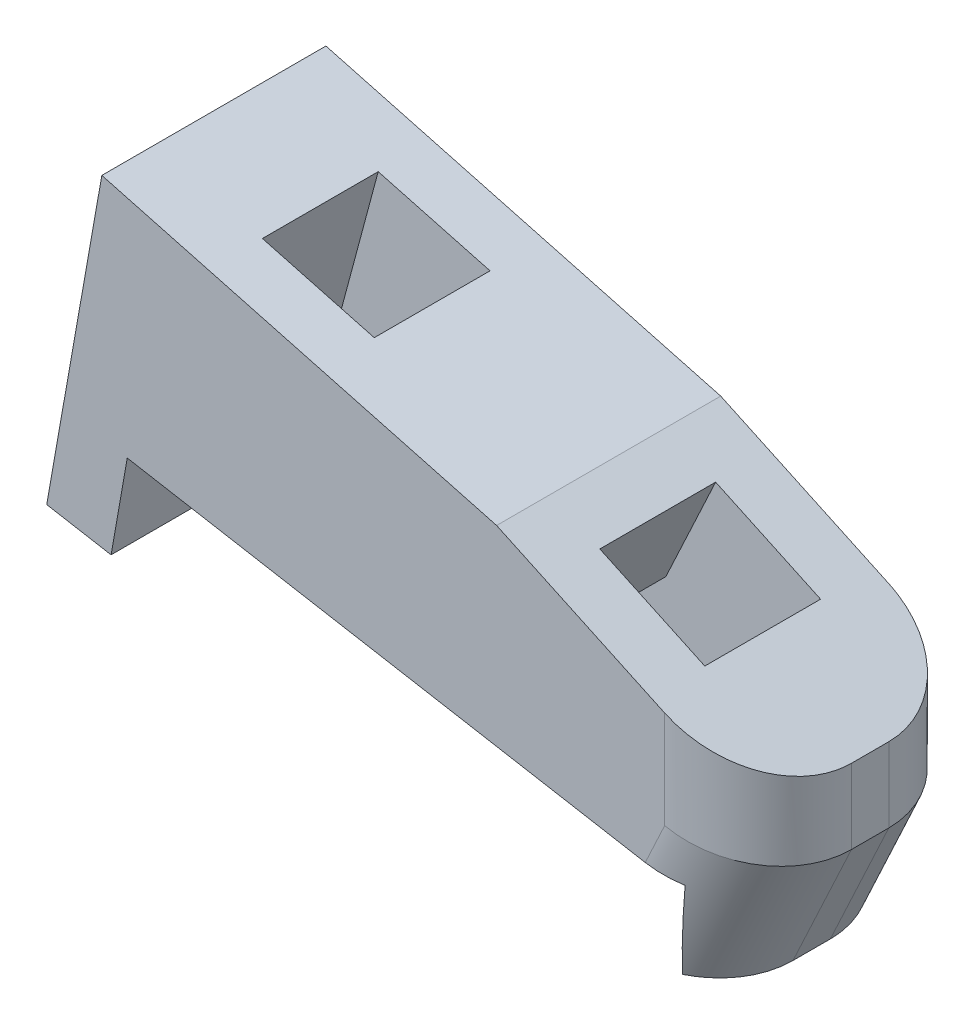
ISO-10303-21;
HEADER;
FILE_DESCRIPTION(('STEP AP214'),'2;1');
FILE_NAME('part.step','',(''),(''),'','','');
FILE_SCHEMA(('AUTOMOTIVE_DESIGN { 1 0 10303 214 1 1 1 1 }'));
ENDSEC;
DATA;
#1=APPLICATION_CONTEXT('core data for automotive mechanical design processes');
#2=APPLICATION_PROTOCOL_DEFINITION('international standard','automotive_design',2000,#1);
#3=PRODUCT_CONTEXT('',#1,'mechanical');
#4=PRODUCT('Part','Part','',(#3));
#5=PRODUCT_RELATED_PRODUCT_CATEGORY('part','',(#4));
#6=PRODUCT_DEFINITION_FORMATION('','',#4);
#7=PRODUCT_DEFINITION_CONTEXT('part definition',#1,'design');
#8=PRODUCT_DEFINITION('design','',#6,#7);
#9=PRODUCT_DEFINITION_SHAPE('','',#8);
#10=(LENGTH_UNIT() NAMED_UNIT(*) SI_UNIT(.MILLI.,.METRE.));
#11=(NAMED_UNIT(*) PLANE_ANGLE_UNIT() SI_UNIT($,.RADIAN.));
#12=(NAMED_UNIT(*) SI_UNIT($,.STERADIAN.) SOLID_ANGLE_UNIT());
#13=UNCERTAINTY_MEASURE_WITH_UNIT(LENGTH_MEASURE(1.E-05),#10,'distance_accuracy_value','');
#14=(GEOMETRIC_REPRESENTATION_CONTEXT(3) GLOBAL_UNCERTAINTY_ASSIGNED_CONTEXT((#13)) GLOBAL_UNIT_ASSIGNED_CONTEXT((#10,
#11,#12)) REPRESENTATION_CONTEXT('',''));
#15=CARTESIAN_POINT('',(0.,0.,0.));
#16=DIRECTION('',(0.,0.,1.));
#17=DIRECTION('',(1.,0.,0.));
#18=AXIS2_PLACEMENT_3D('',#15,#16,#17);
#19=CARTESIAN_POINT('',(41.0409101129452,21.9818480590372,-6.));
#20=DIRECTION('',(1.,0.,0.));
#21=DIRECTION('',(0.,0.,-1.));
#22=AXIS2_PLACEMENT_3D('',#19,#20,#21);
#23=PLANE('',#22);
#24=DIRECTION('',(0.,0.,1.));
#25=VECTOR('',#24,1.);
#26=CARTESIAN_POINT('',(41.0409101129452,21.9818480590372,-6.));
#27=LINE('',#26,#25);
#28=CARTESIAN_POINT('',(41.0409101129452,21.9818480590372,-1.));
#29=VERTEX_POINT('',#28);
#30=CARTESIAN_POINT('',(41.0409101129452,21.9818480590372,1.));
#31=VERTEX_POINT('',#30);
#32=EDGE_CURVE('E286',#29,#31,#27,.T.);
#33=ORIENTED_EDGE('',*,*,#32,.F.);
#34=DIRECTION('',(0.,1.,0.));
#35=VECTOR('',#34,1.);
#36=CARTESIAN_POINT('',(41.0409101129452,21.9818480590372,-1.));
#37=LINE('',#36,#35);
#38=CARTESIAN_POINT('',(41.0409101129452,25.9818480590371,-1.));
#39=VERTEX_POINT('',#38);
#40=EDGE_CURVE('E334',#29,#39,#37,.T.);
#41=ORIENTED_EDGE('',*,*,#40,.T.);
#42=DIRECTION('',(0.,0.,1.));
#43=VECTOR('',#42,1.);
#44=CARTESIAN_POINT('',(41.0409101129452,25.9818480590371,-6.));
#45=LINE('',#44,#43);
#46=CARTESIAN_POINT('',(41.0409101129452,25.9818480590371,1.));
#47=VERTEX_POINT('',#46);
#48=EDGE_CURVE('E285',#39,#47,#45,.T.);
#49=ORIENTED_EDGE('',*,*,#48,.T.);
#50=DIRECTION('',(0.,1.,0.));
#51=VECTOR('',#50,1.);
#52=CARTESIAN_POINT('',(41.0409101129452,21.9818480590372,1.));
#53=LINE('',#52,#51);
#54=EDGE_CURVE('E332',#47,#31,#53,.F.);
#55=ORIENTED_EDGE('',*,*,#54,.T.);
#56=EDGE_LOOP('',(#33,#41,#49,#55));
#57=FACE_BOUND('',#56,.T.);
#58=ADVANCED_FACE('F35',(#57),#23,.T.);
#59=CARTESIAN_POINT('',(37.9102707761156,15.2681703355866,-6.));
#60=DIRECTION('',(0.906307787036649,-0.422618261740702,0.));
#61=DIRECTION('',(0.422618261740702,0.906307787036649,0.));
#62=AXIS2_PLACEMENT_3D('',#59,#60,#61);
#63=PLANE('',#62);
#64=DIRECTION('',(0.,0.,1.));
#65=VECTOR('',#64,1.);
#66=CARTESIAN_POINT('',(37.9102707761156,15.2681703355866,-6.));
#67=LINE('',#66,#65);
#68=CARTESIAN_POINT('',(37.9102707761156,15.2681703355866,-1.));
#69=VERTEX_POINT('',#68);
#70=CARTESIAN_POINT('',(37.9102707761156,15.2681703355866,1.));
#71=VERTEX_POINT('',#70);
#72=EDGE_CURVE('E290',#69,#71,#67,.T.);
#73=ORIENTED_EDGE('',*,*,#72,.F.);
#74=DIRECTION('',(0.422618261740702,0.906307787036649,0.));
#75=VECTOR('',#74,1.);
#76=CARTESIAN_POINT('',(37.9102707761156,15.2681703355866,-1.));
#77=LINE('',#76,#75);
#78=EDGE_CURVE('E313',#69,#29,#77,.T.);
#79=ORIENTED_EDGE('',*,*,#78,.T.);
#80=ORIENTED_EDGE('',*,*,#32,.T.);
#81=DIRECTION('',(0.422618261740702,0.906307787036649,0.));
#82=VECTOR('',#81,1.);
#83=CARTESIAN_POINT('',(37.9102707761156,15.2681703355866,1.));
#84=LINE('',#83,#82);
#85=EDGE_CURVE('E289',#31,#71,#84,.F.);
#86=ORIENTED_EDGE('',*,*,#85,.T.);
#87=EDGE_LOOP('',(#73,#79,#80,#86));
#88=FACE_BOUND('',#87,.T.);
#89=ADVANCED_FACE('F404',(#88),#63,.T.);
#90=CARTESIAN_POINT('',(35.9406552700911,15.6154666909205,-6.));
#91=DIRECTION('',(-0.173648177666939,-0.984807753012206,0.));
#92=DIRECTION('',(0.984807753012207,-0.173648177666939,0.));
#93=AXIS2_PLACEMENT_3D('',#90,#91,#92);
#94=PLANE('',#93);
#95=DIRECTION('',(0.,0.,1.));
#96=VECTOR('',#95,1.);
#97=CARTESIAN_POINT('',(35.9406552700911,15.6154666909205,-6.));
#98=LINE('',#97,#96);
#99=CARTESIAN_POINT('',(35.9406552700911,15.6154666909205,-4.94796982235332));
#100=VERTEX_POINT('',#99);
#101=CARTESIAN_POINT('',(35.9406552700911,15.6154666909205,4.94796982235331));
#102=VERTEX_POINT('',#101);
#103=EDGE_CURVE('E293',#100,#102,#98,.T.);
#104=ORIENTED_EDGE('',*,*,#103,.F.);
#105=CARTESIAN_POINT('',(32.812530731232,16.1670394461376,-1.));
#106=DIRECTION('',(-0.173648177666939,-0.984807753012206,0.));
#107=DIRECTION('',(0.984807753012207,-0.173648177666939,0.));
#108=AXIS2_PLACEMENT_3D('',#105,#106,#107);
#109=ELLIPSE('',#108,5.17638090205041,5.);
#110=EDGE_CURVE('E330',#100,#69,#109,.T.);
#111=ORIENTED_EDGE('',*,*,#110,.T.);
#112=ORIENTED_EDGE('',*,*,#72,.T.);
#113=CARTESIAN_POINT('',(32.812530731232,16.1670394461376,1.));
#114=DIRECTION('',(-0.173648177666939,-0.984807753012206,0.));
#115=DIRECTION('',(-0.984807753012207,0.173648177666939,0.));
#116=AXIS2_PLACEMENT_3D('',#113,#114,#115);
#117=ELLIPSE('',#116,5.17638090205041,5.);
#118=EDGE_CURVE('E328',#71,#102,#117,.T.);
#119=ORIENTED_EDGE('',*,*,#118,.T.);
#120=EDGE_LOOP('',(#104,#111,#112,#119));
#121=FACE_BOUND('',#120,.T.);
#122=ADVANCED_FACE('F410',(#121),#94,.T.);
#123=CARTESIAN_POINT('',(36.8088961584259,20.5395054559815,-6.));
#124=DIRECTION('',(-0.984807753012206,0.173648177666941,0.));
#125=DIRECTION('',(-0.173648177666941,-0.984807753012206,0.));
#126=AXIS2_PLACEMENT_3D('',#123,#124,#125);
#127=PLANE('',#126);
#128=DIRECTION('',(0.,0.,1.));
#129=VECTOR('',#128,1.);
#130=CARTESIAN_POINT('',(36.8088961584259,20.5395054559815,-6.));
#131=LINE('',#130,#129);
#132=CARTESIAN_POINT('',(36.8088961584259,20.5395054559815,-5.67469095455987));
#133=VERTEX_POINT('',#132);
#134=CARTESIAN_POINT('',(36.8088961584259,20.5395054559815,5.67469095455987));
#135=VERTEX_POINT('',#134);
#136=EDGE_CURVE('E296',#133,#135,#131,.T.);
#137=ORIENTED_EDGE('',*,*,#136,.F.);
#138=CARTESIAN_POINT('',(37.9991528166323,27.2897864023461,-1.));
#139=DIRECTION('',(-0.984807753012206,0.173648177666941,0.));
#140=DIRECTION('',(0.173648177666941,0.984807753012206,0.));
#141=AXIS2_PLACEMENT_3D('',#138,#139,#140);
#142=ELLIPSE('',#141,19.3185165257819,5.);
#143=EDGE_CURVE('E326',#133,#100,#142,.T.);
#144=ORIENTED_EDGE('',*,*,#143,.T.);
#145=ORIENTED_EDGE('',*,*,#103,.T.);
#146=CARTESIAN_POINT('',(37.9991528166323,27.2897864023461,1.));
#147=DIRECTION('',(-0.984807753012206,0.173648177666941,0.));
#148=DIRECTION('',(-0.173648177666941,-0.984807753012206,0.));
#149=AXIS2_PLACEMENT_3D('',#146,#147,#148);
#150=ELLIPSE('',#149,19.3185165257819,5.);
#151=EDGE_CURVE('E324',#102,#135,#150,.T.);
#152=ORIENTED_EDGE('',*,*,#151,.T.);
#153=EDGE_LOOP('',(#137,#144,#145,#152));
#154=FACE_BOUND('',#153,.T.);
#155=ADVANCED_FACE('F440',(#154),#127,.T.);
#156=CARTESIAN_POINT('',(7.26466356805965,25.7489507859897,-6.));
#157=DIRECTION('',(-0.173648177666939,-0.984807753012206,0.));
#158=DIRECTION('',(0.984807753012206,-0.173648177666939,0.));
#159=AXIS2_PLACEMENT_3D('',#156,#157,#158);
#160=PLANE('',#159);
#161=DIRECTION('',(0.,0.,1.));
#162=VECTOR('',#161,1.);
#163=CARTESIAN_POINT('',(31.9030176814972,21.404544195541,-6.));
#164=LINE('',#163,#162);
#165=CARTESIAN_POINT('',(31.9030176814972,21.404544195541,-3.1));
#166=VERTEX_POINT('',#165);
#167=CARTESIAN_POINT('',(31.9030176814972,21.404544195541,3.1));
#168=VERTEX_POINT('',#167);
#169=EDGE_CURVE('E11',#166,#168,#164,.T.);
#170=ORIENTED_EDGE('',*,*,#169,.F.);
#171=DIRECTION('',(0.984807753012207,-0.173648177666938,0.));
#172=VECTOR('',#171,1.);
#173=CARTESIAN_POINT('',(24.4003184704721,22.7274724945849,-3.1));
#174=LINE('',#173,#172);
#175=CARTESIAN_POINT('',(24.4003184704721,22.7274724945849,-3.1));
#176=VERTEX_POINT('',#175);
#177=EDGE_CURVE('E231',#176,#166,#174,.T.);
#178=ORIENTED_EDGE('',*,*,#177,.F.);
#179=DIRECTION('',(0.,0.,-1.));
#180=VECTOR('',#179,1.);
#181=CARTESIAN_POINT('',(24.4003184704721,22.7274724945849,3.1));
#182=LINE('',#181,#180);
#183=CARTESIAN_POINT('',(24.4003184704721,22.7274724945849,3.1));
#184=VERTEX_POINT('',#183);
#185=EDGE_CURVE('E235',#184,#176,#182,.T.);
#186=ORIENTED_EDGE('',*,*,#185,.F.);
#187=DIRECTION('',(-0.984807753012207,0.173648177666938,0.));
#188=VECTOR('',#187,1.);
#189=CARTESIAN_POINT('',(24.4003184704721,22.7274724945849,3.1));
#190=LINE('',#189,#188);
#191=EDGE_CURVE('E242',#168,#184,#190,.T.);
#192=ORIENTED_EDGE('',*,*,#191,.F.);
#193=EDGE_LOOP('',(#170,#178,#186,#192));
#194=FACE_BOUND('',#193,.T.);
#195=DIRECTION('',(0.984807753012207,-0.173648177666938,0.));
#196=VECTOR('',#195,1.);
#197=CARTESIAN_POINT('',(9.62820217528898,25.332195159589,-3.1));
#198=LINE('',#197,#196);
#199=CARTESIAN_POINT('',(8.61648265880179,25.510588607255,-3.1));
#200=VERTEX_POINT('',#199);
#201=CARTESIAN_POINT('',(15.7340102439647,24.255576458054,-3.1));
#202=VERTEX_POINT('',#201);
#203=EDGE_CURVE('E367',#200,#202,#198,.T.);
#204=ORIENTED_EDGE('',*,*,#203,.F.);
#205=DIRECTION('',(0.,0.,-1.));
#206=VECTOR('',#205,1.);
#207=CARTESIAN_POINT('',(8.61648265880179,25.510588607255,-6.));
#208=LINE('',#207,#206);
#209=CARTESIAN_POINT('',(8.61648265880179,25.510588607255,3.1));
#210=VERTEX_POINT('',#209);
#211=EDGE_CURVE('E225',#210,#200,#208,.T.);
#212=ORIENTED_EDGE('',*,*,#211,.F.);
#213=DIRECTION('',(-0.984807753012207,0.173648177666938,0.));
#214=VECTOR('',#213,1.);
#215=CARTESIAN_POINT('',(9.62820217528898,25.332195159589,3.1));
#216=LINE('',#215,#214);
#217=CARTESIAN_POINT('',(15.7340102439646,24.255576458054,3.1));
#218=VERTEX_POINT('',#217);
#219=EDGE_CURVE('E366',#218,#210,#216,.T.);
#220=ORIENTED_EDGE('',*,*,#219,.F.);
#221=DIRECTION('',(0.,0.,1.));
#222=VECTOR('',#221,1.);
#223=CARTESIAN_POINT('',(15.7340102439647,24.255576458054,3.1));
#224=LINE('',#223,#222);
#225=EDGE_CURVE('E248',#202,#218,#224,.T.);
#226=ORIENTED_EDGE('',*,*,#225,.F.);
#227=EDGE_LOOP('',(#204,#212,#220,#226));
#228=FACE_BOUND('',#227,.T.);
#229=DIRECTION('',(0.984807753012207,-0.173648177666939,0.));
#230=VECTOR('',#229,1.);
#231=CARTESIAN_POINT('',(7.26466356805965,25.7489507859897,-6.));
#232=LINE('',#231,#230);
#233=CARTESIAN_POINT('',(7.26466356805965,25.7489507859897,-6.));
#234=VERTEX_POINT('',#233);
#235=CARTESIAN_POINT('',(35.0001638301643,20.8584337663336,-6.));
#236=VERTEX_POINT('',#235);
#237=EDGE_CURVE('E282',#234,#236,#232,.T.);
#238=ORIENTED_EDGE('',*,*,#237,.T.);
#239=CARTESIAN_POINT('',(35.0001638301643,20.8584337663336,-1.));
#240=DIRECTION('',(-0.173648177666939,-0.984807753012206,0.));
#241=DIRECTION('',(0.984807753012206,-0.173648177666939,0.));
#242=AXIS2_PLACEMENT_3D('',#239,#240,#241);
#243=ELLIPSE('',#242,5.17638090205041,5.);
#244=EDGE_CURVE('E322',#236,#133,#243,.T.);
#245=ORIENTED_EDGE('',*,*,#244,.T.);
#246=ORIENTED_EDGE('',*,*,#136,.T.);
#247=CARTESIAN_POINT('',(35.0001638301643,20.8584337663336,1.));
#248=DIRECTION('',(-0.173648177666939,-0.984807753012206,0.));
#249=DIRECTION('',(-0.984807753012206,0.173648177666939,0.));
#250=AXIS2_PLACEMENT_3D('',#247,#248,#249);
#251=ELLIPSE('',#250,5.17638090205041,5.);
#252=CARTESIAN_POINT('',(35.0001638301643,20.8584337663336,6.));
#253=VERTEX_POINT('',#252);
#254=EDGE_CURVE('E320',#135,#253,#251,.T.);
#255=ORIENTED_EDGE('',*,*,#254,.T.);
#256=DIRECTION('',(0.984807753012207,-0.173648177666939,0.));
#257=VECTOR('',#256,1.);
#258=CARTESIAN_POINT('',(7.26466356805965,25.7489507859897,6.));
#259=LINE('',#258,#257);
#260=CARTESIAN_POINT('',(7.26466356805965,25.7489507859897,6.));
#261=VERTEX_POINT('',#260);
#262=EDGE_CURVE('E265',#261,#253,#259,.T.);
#263=ORIENTED_EDGE('',*,*,#262,.F.);
#264=DIRECTION('',(0.,0.,1.));
#265=VECTOR('',#264,1.);
#266=CARTESIAN_POINT('',(7.26466356805965,25.7489507859897,-6.));
#267=LINE('',#266,#265);
#268=EDGE_CURVE('E299',#234,#261,#267,.T.);
#269=ORIENTED_EDGE('',*,*,#268,.F.);
#270=EDGE_LOOP('',(#238,#245,#246,#255,#263,#269));
#271=FACE_BOUND('',#270,.T.);
#272=ADVANCED_FACE('F363',(#194,#228,#271),#160,.T.);
#273=CARTESIAN_POINT('',(6.39642267972497,20.8249120209286,-6.));
#274=DIRECTION('',(0.984807753012207,-0.173648177666938,0.));
#275=DIRECTION('',(0.173648177666938,0.984807753012207,0.));
#276=AXIS2_PLACEMENT_3D('',#273,#274,#275);
#277=PLANE('',#276);
#278=ORIENTED_EDGE('',*,*,#268,.T.);
#279=DIRECTION('',(0.173648177666938,0.984807753012207,0.));
#280=VECTOR('',#279,1.);
#281=CARTESIAN_POINT('',(6.39642267972497,20.8249120209286,6.));
#282=LINE('',#281,#280);
#283=CARTESIAN_POINT('',(6.39642267972497,20.8249120209286,6.));
#284=VERTEX_POINT('',#283);
#285=EDGE_CURVE('E262',#284,#261,#282,.T.);
#286=ORIENTED_EDGE('',*,*,#285,.F.);
#287=DIRECTION('',(0.,0.,1.));
#288=VECTOR('',#287,1.);
#289=CARTESIAN_POINT('',(6.39642267972497,20.8249120209286,-6.));
#290=LINE('',#289,#288);
#291=CARTESIAN_POINT('',(6.39642267972497,20.8249120209286,-6.));
#292=VERTEX_POINT('',#291);
#293=EDGE_CURVE('E301',#292,#284,#290,.T.);
#294=ORIENTED_EDGE('',*,*,#293,.F.);
#295=DIRECTION('',(0.173648177666938,0.984807753012207,0.));
#296=VECTOR('',#295,1.);
#297=CARTESIAN_POINT('',(6.39642267972497,20.8249120209286,-6.));
#298=LINE('',#297,#296);
#299=EDGE_CURVE('E279',#292,#234,#298,.T.);
#300=ORIENTED_EDGE('',*,*,#299,.T.);
#301=EDGE_LOOP('',(#278,#286,#294,#300));
#302=FACE_BOUND('',#301,.T.);
#303=ADVANCED_FACE('F459',(#302),#277,.T.);
#304=CARTESIAN_POINT('',(2.94959554418224,21.4326806427629,-6.));
#305=DIRECTION('',(-0.173648177666938,-0.984807753012207,0.));
#306=DIRECTION('',(0.984807753012207,-0.173648177666938,0.));
#307=AXIS2_PLACEMENT_3D('',#304,#305,#306);
#308=PLANE('',#307);
#309=ORIENTED_EDGE('',*,*,#293,.T.);
#310=DIRECTION('',(0.984807753012207,-0.173648177666938,0.));
#311=VECTOR('',#310,1.);
#312=CARTESIAN_POINT('',(2.94959554418224,21.4326806427629,6.));
#313=LINE('',#312,#311);
#314=CARTESIAN_POINT('',(2.94959554418224,21.4326806427629,6.));
#315=VERTEX_POINT('',#314);
#316=EDGE_CURVE('E259',#315,#284,#313,.T.);
#317=ORIENTED_EDGE('',*,*,#316,.F.);
#318=DIRECTION('',(0.,0.,1.));
#319=VECTOR('',#318,1.);
#320=CARTESIAN_POINT('',(2.94959554418224,21.4326806427629,-6.));
#321=LINE('',#320,#319);
#322=CARTESIAN_POINT('',(2.94959554418224,21.4326806427629,-6.));
#323=VERTEX_POINT('',#322);
#324=EDGE_CURVE('E303',#323,#315,#321,.T.);
#325=ORIENTED_EDGE('',*,*,#324,.F.);
#326=DIRECTION('',(0.984807753012207,-0.173648177666938,0.));
#327=VECTOR('',#326,1.);
#328=CARTESIAN_POINT('',(2.94959554418224,21.4326806427629,-6.));
#329=LINE('',#328,#327);
#330=EDGE_CURVE('E276',#323,#292,#329,.T.);
#331=ORIENTED_EDGE('',*,*,#330,.T.);
#332=EDGE_LOOP('',(#309,#317,#325,#331));
#333=FACE_BOUND('',#332,.T.);
#334=ADVANCED_FACE('F463',(#333),#308,.T.);
#335=CARTESIAN_POINT('',(5.90161456452025,38.1744124439706,-6.));
#336=DIRECTION('',(-0.984807753012206,0.17364817766694,0.));
#337=DIRECTION('',(-0.17364817766694,-0.984807753012206,0.));
#338=AXIS2_PLACEMENT_3D('',#335,#336,#337);
#339=PLANE('',#338);
#340=ORIENTED_EDGE('',*,*,#324,.T.);
#341=DIRECTION('',(-0.17364817766694,-0.984807753012206,0.));
#342=VECTOR('',#341,1.);
#343=CARTESIAN_POINT('',(5.90161456452025,38.1744124439706,6.));
#344=LINE('',#343,#342);
#345=CARTESIAN_POINT('',(5.90161456452025,38.1744124439706,6.));
#346=VERTEX_POINT('',#345);
#347=EDGE_CURVE('E256',#346,#315,#344,.T.);
#348=ORIENTED_EDGE('',*,*,#347,.F.);
#349=DIRECTION('',(0.,0.,1.));
#350=VECTOR('',#349,1.);
#351=CARTESIAN_POINT('',(5.90161456452025,38.1744124439706,-6.));
#352=LINE('',#351,#350);
#353=CARTESIAN_POINT('',(5.90161456452025,38.1744124439706,-6.));
#354=VERTEX_POINT('',#353);
#355=EDGE_CURVE('E305',#354,#346,#352,.T.);
#356=ORIENTED_EDGE('',*,*,#355,.F.);
#357=DIRECTION('',(-0.17364817766694,-0.984807753012206,0.));
#358=VECTOR('',#357,1.);
#359=CARTESIAN_POINT('',(5.90161456452025,38.1744124439706,-6.));
#360=LINE('',#359,#358);
#361=EDGE_CURVE('E273',#354,#323,#360,.T.);
#362=ORIENTED_EDGE('',*,*,#361,.T.);
#363=EDGE_LOOP('',(#340,#348,#356,#362));
#364=FACE_BOUND('',#363,.T.);
#365=ADVANCED_FACE('F467',(#364),#339,.T.);
#366=CARTESIAN_POINT('',(27.0409101129452,32.5101552732071,-6.));
#367=DIRECTION('',(0.258819045102528,0.965925826289066,0.));
#368=DIRECTION('',(-0.965925826289066,0.258819045102528,0.));
#369=AXIS2_PLACEMENT_3D('',#366,#367,#368);
#370=PLANE('',#369);
#371=DIRECTION('',(0.,0.,-1.));
#372=VECTOR('',#371,1.);
#373=CARTESIAN_POINT('',(17.589317062618,35.0427019982301,-3.1));
#374=LINE('',#373,#372);
#375=CARTESIAN_POINT('',(17.589317062618,35.0427019982301,3.1));
#376=VERTEX_POINT('',#375);
#377=CARTESIAN_POINT('',(17.589317062618,35.04270199823,-3.1));
#378=VERTEX_POINT('',#377);
#379=EDGE_CURVE('E499',#376,#378,#374,.T.);
#380=ORIENTED_EDGE('',*,*,#379,.F.);
#381=DIRECTION('',(0.965925826289068,-0.258819045102521,0.));
#382=VECTOR('',#381,1.);
#383=CARTESIAN_POINT('',(11.6005769396258,36.6473800778657,3.1));
#384=LINE('',#383,#382);
#385=CARTESIAN_POINT('',(11.6005769396258,36.6473800778657,3.1));
#386=VERTEX_POINT('',#385);
#387=EDGE_CURVE('E508',#386,#376,#384,.T.);
#388=ORIENTED_EDGE('',*,*,#387,.F.);
#389=DIRECTION('',(0.,0.,1.));
#390=VECTOR('',#389,1.);
#391=CARTESIAN_POINT('',(11.6005769396258,36.6473800778657,-3.1));
#392=LINE('',#391,#390);
#393=CARTESIAN_POINT('',(11.6005769396258,36.6473800778657,-3.1));
#394=VERTEX_POINT('',#393);
#395=EDGE_CURVE('E506',#394,#386,#392,.T.);
#396=ORIENTED_EDGE('',*,*,#395,.F.);
#397=DIRECTION('',(-0.965925826289068,0.258819045102521,0.));
#398=VECTOR('',#397,1.);
#399=CARTESIAN_POINT('',(11.6005769396258,36.6473800778657,-3.1));
#400=LINE('',#399,#398);
#401=EDGE_CURVE('E504',#378,#394,#400,.T.);
#402=ORIENTED_EDGE('',*,*,#401,.F.);
#403=EDGE_LOOP('',(#380,#388,#396,#402));
#404=FACE_BOUND('',#403,.T.);
#405=ORIENTED_EDGE('',*,*,#355,.T.);
#406=DIRECTION('',(-0.965925826289066,0.258819045102528,0.));
#407=VECTOR('',#406,1.);
#408=CARTESIAN_POINT('',(27.0409101129452,32.5101552732071,6.));
#409=LINE('',#408,#407);
#410=CARTESIAN_POINT('',(27.0409101129452,32.5101552732071,6.));
#411=VERTEX_POINT('',#410);
#412=EDGE_CURVE('E252',#411,#346,#409,.T.);
#413=ORIENTED_EDGE('',*,*,#412,.F.);
#414=DIRECTION('',(0.,0.,1.));
#415=VECTOR('',#414,1.);
#416=CARTESIAN_POINT('',(27.0409101129452,32.5101552732071,-6.));
#417=LINE('',#416,#415);
#418=CARTESIAN_POINT('',(27.0409101129452,32.5101552732071,-6.));
#419=VERTEX_POINT('',#418);
#420=EDGE_CURVE('E307',#419,#411,#417,.T.);
#421=ORIENTED_EDGE('',*,*,#420,.F.);
#422=DIRECTION('',(-0.965925826289066,0.258819045102528,0.));
#423=VECTOR('',#422,1.);
#424=CARTESIAN_POINT('',(27.0409101129452,32.5101552732071,-6.));
#425=LINE('',#424,#423);
#426=EDGE_CURVE('E270',#419,#354,#425,.T.);
#427=ORIENTED_EDGE('',*,*,#426,.T.);
#428=EDGE_LOOP('',(#405,#413,#421,#427));
#429=FACE_BOUND('',#428,.T.);
#430=ADVANCED_FACE('F473',(#404,#429),#370,.T.);
#431=CARTESIAN_POINT('',(41.0409101129452,25.9818480590371,-6.));
#432=DIRECTION('',(0.422618261740701,0.906307787036649,0.));
#433=DIRECTION('',(-0.906307787036649,0.422618261740701,0.));
#434=AXIS2_PLACEMENT_3D('',#431,#432,#433);
#435=PLANE('',#434);
#436=DIRECTION('',(0.,0.,-1.));
#437=VECTOR('',#436,1.);
#438=CARTESIAN_POINT('',(35.2883109749787,28.6643290913667,-3.1));
#439=LINE('',#438,#437);
#440=CARTESIAN_POINT('',(35.2883109749787,28.6643290913667,3.1));
#441=VERTEX_POINT('',#440);
#442=CARTESIAN_POINT('',(35.2883109749787,28.6643290913667,-3.1));
#443=VERTEX_POINT('',#442);
#444=EDGE_CURVE('E348',#441,#443,#439,.T.);
#445=ORIENTED_EDGE('',*,*,#444,.F.);
#446=DIRECTION('',(0.906307787036649,-0.422618261740702,0.));
#447=VECTOR('',#446,1.);
#448=CARTESIAN_POINT('',(29.6692026953515,31.2845623141591,3.1));
#449=LINE('',#448,#447);
#450=CARTESIAN_POINT('',(29.6692026953515,31.2845623141591,3.1));
#451=VERTEX_POINT('',#450);
#452=EDGE_CURVE('E488',#451,#441,#449,.T.);
#453=ORIENTED_EDGE('',*,*,#452,.F.);
#454=DIRECTION('',(0.,0.,1.));
#455=VECTOR('',#454,1.);
#456=CARTESIAN_POINT('',(29.6692026953515,31.2845623141591,-3.1));
#457=LINE('',#456,#455);
#458=CARTESIAN_POINT('',(29.6692026953515,31.2845623141591,-3.1));
#459=VERTEX_POINT('',#458);
#460=EDGE_CURVE('E210',#459,#451,#457,.T.);
#461=ORIENTED_EDGE('',*,*,#460,.F.);
#462=DIRECTION('',(-0.906307787036649,0.422618261740702,0.));
#463=VECTOR('',#462,1.);
#464=CARTESIAN_POINT('',(29.6692026953515,31.2845623141591,-3.1));
#465=LINE('',#464,#463);
#466=EDGE_CURVE('E490',#443,#459,#465,.T.);
#467=ORIENTED_EDGE('',*,*,#466,.F.);
#468=EDGE_LOOP('',(#445,#453,#461,#467));
#469=FACE_BOUND('',#468,.T.);
#470=ORIENTED_EDGE('',*,*,#48,.F.);
#471=CARTESIAN_POINT('',(36.0409101129452,28.3133863498121,-1.));
#472=DIRECTION('',(0.422618261740701,0.906307787036649,0.));
#473=DIRECTION('',(-0.906307787036649,0.422618261740701,0.));
#474=AXIS2_PLACEMENT_3D('',#471,#472,#473);
#475=ELLIPSE('',#474,5.51688959481246,5.);
#476=CARTESIAN_POINT('',(36.0409101129452,28.3133863498121,-6.));
#477=VERTEX_POINT('',#476);
#478=EDGE_CURVE('E338',#39,#477,#475,.T.);
#479=ORIENTED_EDGE('',*,*,#478,.T.);
#480=DIRECTION('',(-0.906307787036649,0.422618261740701,0.));
#481=VECTOR('',#480,1.);
#482=CARTESIAN_POINT('',(41.0409101129452,25.9818480590371,-6.));
#483=LINE('',#482,#481);
#484=EDGE_CURVE('E268',#477,#419,#483,.T.);
#485=ORIENTED_EDGE('',*,*,#484,.T.);
#486=ORIENTED_EDGE('',*,*,#420,.T.);
#487=DIRECTION('',(-0.906307787036649,0.422618261740701,0.));
#488=VECTOR('',#487,1.);
#489=CARTESIAN_POINT('',(41.0409101129452,25.9818480590371,6.));
#490=LINE('',#489,#488);
#491=CARTESIAN_POINT('',(36.0409101129452,28.3133863498121,6.));
#492=VERTEX_POINT('',#491);
#493=EDGE_CURVE('E250',#492,#411,#490,.T.);
#494=ORIENTED_EDGE('',*,*,#493,.F.);
#495=CARTESIAN_POINT('',(36.0409101129452,28.3133863498121,1.));
#496=DIRECTION('',(0.422618261740701,0.906307787036649,0.));
#497=DIRECTION('',(0.906307787036649,-0.422618261740701,0.));
#498=AXIS2_PLACEMENT_3D('',#495,#496,#497);
#499=ELLIPSE('',#498,5.51688959481246,5.);
#500=EDGE_CURVE('E336',#492,#47,#499,.T.);
#501=ORIENTED_EDGE('',*,*,#500,.T.);
#502=EDGE_LOOP('',(#470,#479,#485,#486,#494,#501));
#503=FACE_BOUND('',#502,.T.);
#504=ADVANCED_FACE('F416',(#469,#503),#435,.T.);
#505=CARTESIAN_POINT('',(0.,0.,-6.));
#506=DIRECTION('',(0.,0.,-1.));
#507=DIRECTION('',(-1.,0.,0.));
#508=AXIS2_PLACEMENT_3D('',#505,#506,#507);
#509=PLANE('',#508);
#510=DIRECTION('',(0.,1.,0.));
#511=VECTOR('',#510,1.);
#512=CARTESIAN_POINT('',(36.0409101129452,0.,-6.));
#513=LINE('',#512,#511);
#514=CARTESIAN_POINT('',(36.0409101129452,23.0903213722519,-6.));
#515=VERTEX_POINT('',#514);
#516=EDGE_CURVE('E316',#477,#515,#513,.F.);
#517=ORIENTED_EDGE('',*,*,#516,.T.);
#518=DIRECTION('',(0.422618261740702,0.906307787036649,0.));
#519=VECTOR('',#518,1.);
#520=CARTESIAN_POINT('',(20.7596740991638,-9.68039501324211,-6.));
#521=LINE('',#520,#519);
#522=EDGE_CURVE('E318',#515,#236,#521,.F.);
#523=ORIENTED_EDGE('',*,*,#522,.T.);
#524=ORIENTED_EDGE('',*,*,#237,.F.);
#525=ORIENTED_EDGE('',*,*,#299,.F.);
#526=ORIENTED_EDGE('',*,*,#330,.F.);
#527=ORIENTED_EDGE('',*,*,#361,.F.);
#528=ORIENTED_EDGE('',*,*,#426,.F.);
#529=ORIENTED_EDGE('',*,*,#484,.F.);
#530=EDGE_LOOP('',(#517,#523,#524,#525,#526,#527,#528,#529));
#531=FACE_BOUND('',#530,.T.);
#532=ADVANCED_FACE('F456',(#531),#509,.T.);
#533=CARTESIAN_POINT('',(0.,0.,6.));
#534=DIRECTION('',(0.,0.,-1.));
#535=DIRECTION('',(-1.,0.,0.));
#536=AXIS2_PLACEMENT_3D('',#533,#534,#535);
#537=PLANE('',#536);
#538=ORIENTED_EDGE('',*,*,#262,.T.);
#539=DIRECTION('',(0.422618261740702,0.906307787036649,0.));
#540=VECTOR('',#539,1.);
#541=CARTESIAN_POINT('',(36.509371177762,24.0949393677407,6.));
#542=LINE('',#541,#540);
#543=CARTESIAN_POINT('',(36.0409101129452,23.0903213722519,6.));
#544=VERTEX_POINT('',#543);
#545=EDGE_CURVE('E342',#253,#544,#542,.T.);
#546=ORIENTED_EDGE('',*,*,#545,.T.);
#547=DIRECTION('',(0.,1.,0.));
#548=VECTOR('',#547,1.);
#549=CARTESIAN_POINT('',(36.0409101129452,25.9818480590371,6.));
#550=LINE('',#549,#548);
#551=EDGE_CURVE('E340',#544,#492,#550,.T.);
#552=ORIENTED_EDGE('',*,*,#551,.T.);
#553=ORIENTED_EDGE('',*,*,#493,.T.);
#554=ORIENTED_EDGE('',*,*,#412,.T.);
#555=ORIENTED_EDGE('',*,*,#347,.T.);
#556=ORIENTED_EDGE('',*,*,#316,.T.);
#557=ORIENTED_EDGE('',*,*,#285,.T.);
#558=EDGE_LOOP('',(#538,#546,#552,#553,#554,#555,#556,#557));
#559=FACE_BOUND('',#558,.T.);
#560=ADVANCED_FACE('F451',(#559),#537,.F.);
#561=CARTESIAN_POINT('',(24.9646750478896,25.9280976918746,-3.1));
#562=DIRECTION('',(0.,0.,-1.));
#563=DIRECTION('',(-1.,0.,0.));
#564=AXIS2_PLACEMENT_3D('',#561,#562,#563);
#565=PLANE('',#564);
#566=ORIENTED_EDGE('',*,*,#177,.T.);
#567=DIRECTION('',(0.422618261740703,0.906307787036648,0.));
#568=VECTOR('',#567,1.);
#569=CARTESIAN_POINT('',(33.9148016243214,25.7188287834976,-3.1));
#570=LINE('',#569,#568);
#571=EDGE_CURVE('E498',#166,#443,#570,.T.);
#572=ORIENTED_EDGE('',*,*,#571,.T.);
#573=ORIENTED_EDGE('',*,*,#466,.T.);
#574=DIRECTION('',(0.422618261740703,0.906307787036648,0.));
#575=VECTOR('',#574,1.);
#576=CARTESIAN_POINT('',(28.2956933446942,28.33906200629,-3.1));
#577=LINE('',#576,#575);
#578=CARTESIAN_POINT('',(27.0037815401476,25.5685482007517,-3.1));
#579=VERTEX_POINT('',#578);
#580=EDGE_CURVE('E216',#579,#459,#577,.T.);
#581=ORIENTED_EDGE('',*,*,#580,.F.);
#582=DIRECTION('',(0.984807753012207,-0.173648177666938,0.));
#583=VECTOR('',#582,1.);
#584=CARTESIAN_POINT('',(24.9646750478896,25.9280976918746,-3.1));
#585=LINE('',#584,#583);
#586=CARTESIAN_POINT('',(24.9646750478896,25.9280976918746,-3.1));
#587=VERTEX_POINT('',#586);
#588=EDGE_CURVE('E224',#587,#579,#585,.T.);
#589=ORIENTED_EDGE('',*,*,#588,.F.);
#590=DIRECTION('',(-0.173648177666938,-0.984807753012207,0.));
#591=VECTOR('',#590,1.);
#592=CARTESIAN_POINT('',(24.9646750478896,25.9280976918746,-3.1));
#593=LINE('',#592,#591);
#594=EDGE_CURVE('E246',#587,#176,#593,.T.);
#595=ORIENTED_EDGE('',*,*,#594,.T.);
#596=EDGE_LOOP('',(#566,#572,#573,#581,#589,#595));
#597=FACE_BOUND('',#596,.T.);
#598=ADVANCED_FACE('F527',(#597),#565,.F.);
#599=CARTESIAN_POINT('',(24.9646750478896,25.9280976918746,3.1));
#600=DIRECTION('',(-0.984807753012207,0.173648177666938,0.));
#601=DIRECTION('',(-0.173648177666938,-0.984807753012207,0.));
#602=AXIS2_PLACEMENT_3D('',#599,#600,#601);
#603=PLANE('',#602);
#604=ORIENTED_EDGE('',*,*,#185,.T.);
#605=ORIENTED_EDGE('',*,*,#594,.F.);
#606=DIRECTION('',(0.,0.,-1.));
#607=VECTOR('',#606,1.);
#608=CARTESIAN_POINT('',(24.9646750478896,25.9280976918746,3.1));
#609=LINE('',#608,#607);
#610=CARTESIAN_POINT('',(24.9646750478896,25.9280976918746,3.1));
#611=VERTEX_POINT('',#610);
#612=EDGE_CURVE('E230',#611,#587,#609,.T.);
#613=ORIENTED_EDGE('',*,*,#612,.F.);
#614=DIRECTION('',(-0.173648177666938,-0.984807753012207,0.));
#615=VECTOR('',#614,1.);
#616=CARTESIAN_POINT('',(24.9646750478896,25.9280976918746,3.1));
#617=LINE('',#616,#615);
#618=EDGE_CURVE('E228',#611,#184,#617,.T.);
#619=ORIENTED_EDGE('',*,*,#618,.T.);
#620=EDGE_LOOP('',(#604,#605,#613,#619));
#621=FACE_BOUND('',#620,.T.);
#622=ADVANCED_FACE('F530',(#621),#603,.F.);
#623=CARTESIAN_POINT('',(24.9646750478896,25.9280976918746,3.1));
#624=DIRECTION('',(0.,0.,1.));
#625=DIRECTION('',(1.,0.,0.));
#626=AXIS2_PLACEMENT_3D('',#623,#624,#625);
#627=PLANE('',#626);
#628=DIRECTION('',(0.422618261740703,0.906307787036648,0.));
#629=VECTOR('',#628,1.);
#630=CARTESIAN_POINT('',(33.9148016243214,25.7188287834976,3.1));
#631=LINE('',#630,#629);
#632=EDGE_CURVE('E215',#168,#441,#631,.T.);
#633=ORIENTED_EDGE('',*,*,#632,.F.);
#634=ORIENTED_EDGE('',*,*,#191,.T.);
#635=ORIENTED_EDGE('',*,*,#618,.F.);
#636=DIRECTION('',(-0.984807753012207,0.173648177666938,0.));
#637=VECTOR('',#636,1.);
#638=CARTESIAN_POINT('',(24.9646750478896,25.9280976918746,3.1));
#639=LINE('',#638,#637);
#640=CARTESIAN_POINT('',(27.0037815401476,25.5685482007517,3.1));
#641=VERTEX_POINT('',#640);
#642=EDGE_CURVE('E221',#641,#611,#639,.T.);
#643=ORIENTED_EDGE('',*,*,#642,.F.);
#644=DIRECTION('',(0.422618261740703,0.906307787036648,0.));
#645=VECTOR('',#644,1.);
#646=CARTESIAN_POINT('',(28.2956933446942,28.33906200629,3.1));
#647=LINE('',#646,#645);
#648=EDGE_CURVE('E205',#641,#451,#647,.T.);
#649=ORIENTED_EDGE('',*,*,#648,.T.);
#650=ORIENTED_EDGE('',*,*,#452,.T.);
#651=EDGE_LOOP('',(#633,#634,#635,#643,#649,#650));
#652=FACE_BOUND('',#651,.T.);
#653=ADVANCED_FACE('F226',(#652),#627,.F.);
#654=CARTESIAN_POINT('',(5.18674290690353,29.4154807509518,0.));
#655=DIRECTION('',(-0.173648177666938,-0.984807753012207,0.));
#656=DIRECTION('',(0.984807753012207,-0.173648177666938,0.));
#657=AXIS2_PLACEMENT_3D('',#654,#655,#656);
#658=PLANE('',#657);
#659=DIRECTION('',(0.,0.,-1.));
#660=VECTOR('',#659,1.);
#661=CARTESIAN_POINT('',(27.0037815401476,25.5685482007517,0.));
#662=LINE('',#661,#660);
#663=EDGE_CURVE('E43',#641,#579,#662,.T.);
#664=ORIENTED_EDGE('',*,*,#663,.F.);
#665=ORIENTED_EDGE('',*,*,#642,.T.);
#666=ORIENTED_EDGE('',*,*,#612,.T.);
#667=ORIENTED_EDGE('',*,*,#588,.T.);
#668=EDGE_LOOP('',(#664,#665,#666,#667));
#669=FACE_BOUND('',#668,.T.);
#670=ADVANCED_FACE('F219',(#669),#658,.T.);
#671=CARTESIAN_POINT('',(16.2983668213822,27.4562016553437,3.1));
#672=DIRECTION('',(0.984807753012207,-0.173648177666938,0.));
#673=DIRECTION('',(0.173648177666938,0.984807753012207,0.));
#674=AXIS2_PLACEMENT_3D('',#671,#672,#673);
#675=PLANE('',#674);
#676=ORIENTED_EDGE('',*,*,#225,.T.);
#677=DIRECTION('',(-0.173648177666938,-0.984807753012207,0.));
#678=VECTOR('',#677,1.);
#679=CARTESIAN_POINT('',(16.2983668213822,27.4562016553437,3.1));
#680=LINE('',#679,#678);
#681=CARTESIAN_POINT('',(16.2983668213822,27.4562016553437,3.1));
#682=VERTEX_POINT('',#681);
#683=EDGE_CURVE('E238',#682,#218,#680,.T.);
#684=ORIENTED_EDGE('',*,*,#683,.F.);
#685=DIRECTION('',(0.,0.,1.));
#686=VECTOR('',#685,1.);
#687=CARTESIAN_POINT('',(16.2983668213822,27.4562016553437,3.1));
#688=LINE('',#687,#686);
#689=CARTESIAN_POINT('',(16.2983668213822,27.4562016553437,-3.1));
#690=VERTEX_POINT('',#689);
#691=EDGE_CURVE('E371',#690,#682,#688,.T.);
#692=ORIENTED_EDGE('',*,*,#691,.F.);
#693=DIRECTION('',(-0.173648177666938,-0.984807753012207,0.));
#694=VECTOR('',#693,1.);
#695=CARTESIAN_POINT('',(16.2983668213822,27.4562016553437,-3.1));
#696=LINE('',#695,#694);
#697=EDGE_CURVE('E253',#690,#202,#696,.T.);
#698=ORIENTED_EDGE('',*,*,#697,.T.);
#699=EDGE_LOOP('',(#676,#684,#692,#698));
#700=FACE_BOUND('',#699,.T.);
#701=ADVANCED_FACE('F388',(#700),#675,.F.);
#702=CARTESIAN_POINT('',(10.1925587527065,28.5328203568787,-3.1));
#703=DIRECTION('',(0.,0.,-1.));
#704=DIRECTION('',(-1.,0.,0.));
#705=AXIS2_PLACEMENT_3D('',#702,#703,#704);
#706=PLANE('',#705);
#707=DIRECTION('',(0.984807753012207,-0.173648177666938,0.));
#708=VECTOR('',#707,1.);
#709=CARTESIAN_POINT('',(10.1925587527065,28.5328203568787,-3.1));
#710=LINE('',#709,#708);
#711=CARTESIAN_POINT('',(15.5899889207465,27.5811077917634,-3.1));
#712=VERTEX_POINT('',#711);
#713=EDGE_CURVE('E381',#712,#690,#710,.T.);
#714=ORIENTED_EDGE('',*,*,#713,.F.);
#715=DIRECTION('',(0.258819045102521,0.965925826289068,0.));
#716=VECTOR('',#715,1.);
#717=CARTESIAN_POINT('',(16.7481551660348,31.9034430627906,-3.1));
#718=LINE('',#717,#716);
#719=EDGE_CURVE('E510',#712,#378,#718,.T.);
#720=ORIENTED_EDGE('',*,*,#719,.T.);
#721=ORIENTED_EDGE('',*,*,#401,.T.);
#722=DIRECTION('',(0.258819045102521,0.965925826289068,0.));
#723=VECTOR('',#722,1.);
#724=CARTESIAN_POINT('',(10.7594150430426,33.5081211424262,-3.1));
#725=LINE('',#724,#723);
#726=EDGE_CURVE('E356',#200,#394,#725,.T.);
#727=ORIENTED_EDGE('',*,*,#726,.F.);
#728=ORIENTED_EDGE('',*,*,#203,.T.);
#729=ORIENTED_EDGE('',*,*,#697,.F.);
#730=EDGE_LOOP('',(#714,#720,#721,#727,#728,#729));
#731=FACE_BOUND('',#730,.T.);
#732=ADVANCED_FACE('F400',(#731),#706,.F.);
#733=CARTESIAN_POINT('',(10.1925587527065,28.5328203568787,3.1));
#734=DIRECTION('',(0.,0.,1.));
#735=DIRECTION('',(1.,0.,0.));
#736=AXIS2_PLACEMENT_3D('',#733,#734,#735);
#737=PLANE('',#736);
#738=ORIENTED_EDGE('',*,*,#219,.T.);
#739=DIRECTION('',(0.258819045102521,0.965925826289068,0.));
#740=VECTOR('',#739,1.);
#741=CARTESIAN_POINT('',(10.7594150430426,33.5081211424262,3.1));
#742=LINE('',#741,#740);
#743=EDGE_CURVE('E358',#210,#386,#742,.T.);
#744=ORIENTED_EDGE('',*,*,#743,.T.);
#745=ORIENTED_EDGE('',*,*,#387,.T.);
#746=DIRECTION('',(0.258819045102521,0.965925826289068,0.));
#747=VECTOR('',#746,1.);
#748=CARTESIAN_POINT('',(16.7481551660348,31.9034430627906,3.1));
#749=LINE('',#748,#747);
#750=CARTESIAN_POINT('',(15.5899889207465,27.5811077917634,3.1));
#751=VERTEX_POINT('',#750);
#752=EDGE_CURVE('E50',#751,#376,#749,.T.);
#753=ORIENTED_EDGE('',*,*,#752,.F.);
#754=DIRECTION('',(-0.984807753012207,0.173648177666938,0.));
#755=VECTOR('',#754,1.);
#756=CARTESIAN_POINT('',(10.1925587527065,28.5328203568787,3.1));
#757=LINE('',#756,#755);
#758=EDGE_CURVE('E374',#682,#751,#757,.T.);
#759=ORIENTED_EDGE('',*,*,#758,.F.);
#760=ORIENTED_EDGE('',*,*,#683,.T.);
#761=EDGE_LOOP('',(#738,#744,#745,#753,#759,#760));
#762=FACE_BOUND('',#761,.T.);
#763=ADVANCED_FACE('F389',(#762),#737,.F.);
#764=CARTESIAN_POINT('',(5.18674290690353,29.4154807509518,0.));
#765=DIRECTION('',(-0.173648177666938,-0.984807753012207,0.));
#766=DIRECTION('',(0.984807753012207,-0.173648177666938,0.));
#767=AXIS2_PLACEMENT_3D('',#764,#765,#766);
#768=PLANE('',#767);
#769=DIRECTION('',(0.,0.,1.));
#770=VECTOR('',#769,1.);
#771=CARTESIAN_POINT('',(15.5899889207465,27.5811077917634,0.));
#772=LINE('',#771,#770);
#773=EDGE_CURVE('E345',#712,#751,#772,.T.);
#774=ORIENTED_EDGE('',*,*,#773,.F.);
#775=ORIENTED_EDGE('',*,*,#713,.T.);
#776=ORIENTED_EDGE('',*,*,#691,.T.);
#777=ORIENTED_EDGE('',*,*,#758,.T.);
#778=EDGE_LOOP('',(#774,#775,#776,#777));
#779=FACE_BOUND('',#778,.T.);
#780=ADVANCED_FACE('F390',(#779),#768,.T.);
#781=CARTESIAN_POINT('',(16.7481551660348,31.9034430627906,-3.1));
#782=DIRECTION('',(0.965925826289068,-0.258819045102521,0.));
#783=DIRECTION('',(0.258819045102521,0.965925826289068,0.));
#784=AXIS2_PLACEMENT_3D('',#781,#782,#783);
#785=PLANE('',#784);
#786=ORIENTED_EDGE('',*,*,#379,.T.);
#787=ORIENTED_EDGE('',*,*,#719,.F.);
#788=ORIENTED_EDGE('',*,*,#773,.T.);
#789=ORIENTED_EDGE('',*,*,#752,.T.);
#790=EDGE_LOOP('',(#786,#787,#788,#789));
#791=FACE_BOUND('',#790,.T.);
#792=ADVANCED_FACE('F392',(#791),#785,.F.);
#793=CARTESIAN_POINT('',(10.7594150430426,33.5081211424262,-3.1));
#794=DIRECTION('',(-0.965925826289068,0.258819045102521,0.));
#795=DIRECTION('',(-0.258819045102521,-0.965925826289068,0.));
#796=AXIS2_PLACEMENT_3D('',#793,#794,#795);
#797=PLANE('',#796);
#798=ORIENTED_EDGE('',*,*,#395,.T.);
#799=ORIENTED_EDGE('',*,*,#743,.F.);
#800=ORIENTED_EDGE('',*,*,#211,.T.);
#801=ORIENTED_EDGE('',*,*,#726,.T.);
#802=EDGE_LOOP('',(#798,#799,#800,#801));
#803=FACE_BOUND('',#802,.T.);
#804=ADVANCED_FACE('F355',(#803),#797,.F.);
#805=CARTESIAN_POINT('',(33.9148016243214,25.7188287834976,-3.1));
#806=DIRECTION('',(0.906307787036648,-0.422618261740703,0.));
#807=DIRECTION('',(0.422618261740703,0.906307787036648,0.));
#808=AXIS2_PLACEMENT_3D('',#805,#806,#807);
#809=PLANE('',#808);
#810=ORIENTED_EDGE('',*,*,#444,.T.);
#811=ORIENTED_EDGE('',*,*,#571,.F.);
#812=ORIENTED_EDGE('',*,*,#169,.T.);
#813=ORIENTED_EDGE('',*,*,#632,.T.);
#814=EDGE_LOOP('',(#810,#811,#812,#813));
#815=FACE_BOUND('',#814,.T.);
#816=ADVANCED_FACE('F660',(#815),#809,.F.);
#817=CARTESIAN_POINT('',(28.2956933446942,28.33906200629,-3.1));
#818=DIRECTION('',(-0.906307787036648,0.422618261740703,0.));
#819=DIRECTION('',(-0.422618261740703,-0.906307787036648,0.));
#820=AXIS2_PLACEMENT_3D('',#817,#818,#819);
#821=PLANE('',#820);
#822=ORIENTED_EDGE('',*,*,#460,.T.);
#823=ORIENTED_EDGE('',*,*,#648,.F.);
#824=ORIENTED_EDGE('',*,*,#663,.T.);
#825=ORIENTED_EDGE('',*,*,#580,.T.);
#826=EDGE_LOOP('',(#822,#823,#824,#825));
#827=FACE_BOUND('',#826,.T.);
#828=ADVANCED_FACE('F207',(#827),#821,.F.);
#829=CARTESIAN_POINT('',(36.0409101129452,21.9818480590372,-1.));
#830=DIRECTION('',(0.,1.,0.));
#831=DIRECTION('',(0.,0.,1.));
#832=AXIS2_PLACEMENT_3D('',#829,#830,#831);
#833=CYLINDRICAL_SURFACE('',#832,5.);
#834=ORIENTED_EDGE('',*,*,#478,.F.);
#835=ORIENTED_EDGE('',*,*,#40,.F.);
#836=CARTESIAN_POINT('',(36.0409101129452,23.0903213722519,-1.));
#837=DIRECTION('',(0.216439613938104,0.976296007119933,0.));
#838=DIRECTION('',(-0.976296007119933,0.216439613938104,0.));
#839=AXIS2_PLACEMENT_3D('',#836,#837,#838);
#840=ELLIPSE('',#839,5.12139757157255,5.);
#841=EDGE_CURVE('E346',#515,#29,#840,.F.);
#842=ORIENTED_EDGE('',*,*,#841,.F.);
#843=ORIENTED_EDGE('',*,*,#516,.F.);
#844=EDGE_LOOP('',(#834,#835,#842,#843));
#845=FACE_BOUND('',#844,.T.);
#846=ADVANCED_FACE('F421',(#845),#833,.T.);
#847=CARTESIAN_POINT('',(33.3787318409323,17.3812616442901,-1.));
#848=DIRECTION('',(0.422618261740702,0.906307787036649,0.));
#849=DIRECTION('',(-0.906307787036649,0.422618261740702,0.));
#850=AXIS2_PLACEMENT_3D('',#847,#848,#849);
#851=CYLINDRICAL_SURFACE('',#850,5.);
#852=ORIENTED_EDGE('',*,*,#244,.F.);
#853=ORIENTED_EDGE('',*,*,#522,.F.);
#854=ORIENTED_EDGE('',*,*,#841,.T.);
#855=ORIENTED_EDGE('',*,*,#78,.F.);
#856=ORIENTED_EDGE('',*,*,#110,.F.);
#857=ORIENTED_EDGE('',*,*,#143,.F.);
#858=EDGE_LOOP('',(#852,#853,#854,#855,#856,#857));
#859=FACE_BOUND('',#858,.T.);
#860=ADVANCED_FACE('F418',(#859),#851,.T.);
#861=CARTESIAN_POINT('',(36.0409101129452,0.,1.));
#862=DIRECTION('',(0.,-1.,0.));
#863=DIRECTION('',(0.,0.,-1.));
#864=AXIS2_PLACEMENT_3D('',#861,#862,#863);
#865=CYLINDRICAL_SURFACE('',#864,5.);
#866=ORIENTED_EDGE('',*,*,#500,.F.);
#867=ORIENTED_EDGE('',*,*,#551,.F.);
#868=CARTESIAN_POINT('',(36.0409101129452,23.0903213722519,1.));
#869=DIRECTION('',(-0.216439613938104,-0.976296007119933,0.));
#870=DIRECTION('',(0.976296007119933,-0.216439613938104,0.));
#871=AXIS2_PLACEMENT_3D('',#868,#869,#870);
#872=ELLIPSE('',#871,5.12139757157255,5.);
#873=EDGE_CURVE('E58',#31,#544,#872,.T.);
#874=ORIENTED_EDGE('',*,*,#873,.F.);
#875=ORIENTED_EDGE('',*,*,#54,.F.);
#876=EDGE_LOOP('',(#866,#867,#874,#875));
#877=FACE_BOUND('',#876,.T.);
#878=ADVANCED_FACE('F37',(#877),#865,.T.);
#879=CARTESIAN_POINT('',(20.7596740991638,-9.68039501324211,1.));
#880=DIRECTION('',(-0.422618261740702,-0.906307787036649,0.));
#881=DIRECTION('',(0.906307787036649,-0.422618261740702,0.));
#882=AXIS2_PLACEMENT_3D('',#879,#880,#881);
#883=CYLINDRICAL_SURFACE('',#882,5.);
#884=ORIENTED_EDGE('',*,*,#118,.F.);
#885=ORIENTED_EDGE('',*,*,#85,.F.);
#886=ORIENTED_EDGE('',*,*,#873,.T.);
#887=ORIENTED_EDGE('',*,*,#545,.F.);
#888=ORIENTED_EDGE('',*,*,#254,.F.);
#889=ORIENTED_EDGE('',*,*,#151,.F.);
#890=EDGE_LOOP('',(#884,#885,#886,#887,#888,#889));
#891=FACE_BOUND('',#890,.T.);
#892=ADVANCED_FACE('F425',(#891),#883,.T.);
#893=CLOSED_SHELL('',(#58,#89,#122,#155,#272,#303,#334,#365,#430,#504,#532,#560,#598,#622,#653,
#670,#701,#732,#763,#780,#792,#804,#816,#828,#846,#860,#878,#892));
#894=MANIFOLD_SOLID_BREP('B2',#893);
#895=ADVANCED_BREP_SHAPE_REPRESENTATION('',(#18,#894),#14);
#896=SHAPE_DEFINITION_REPRESENTATION(#9,#895);
ENDSEC;
END-ISO-10303-21;
